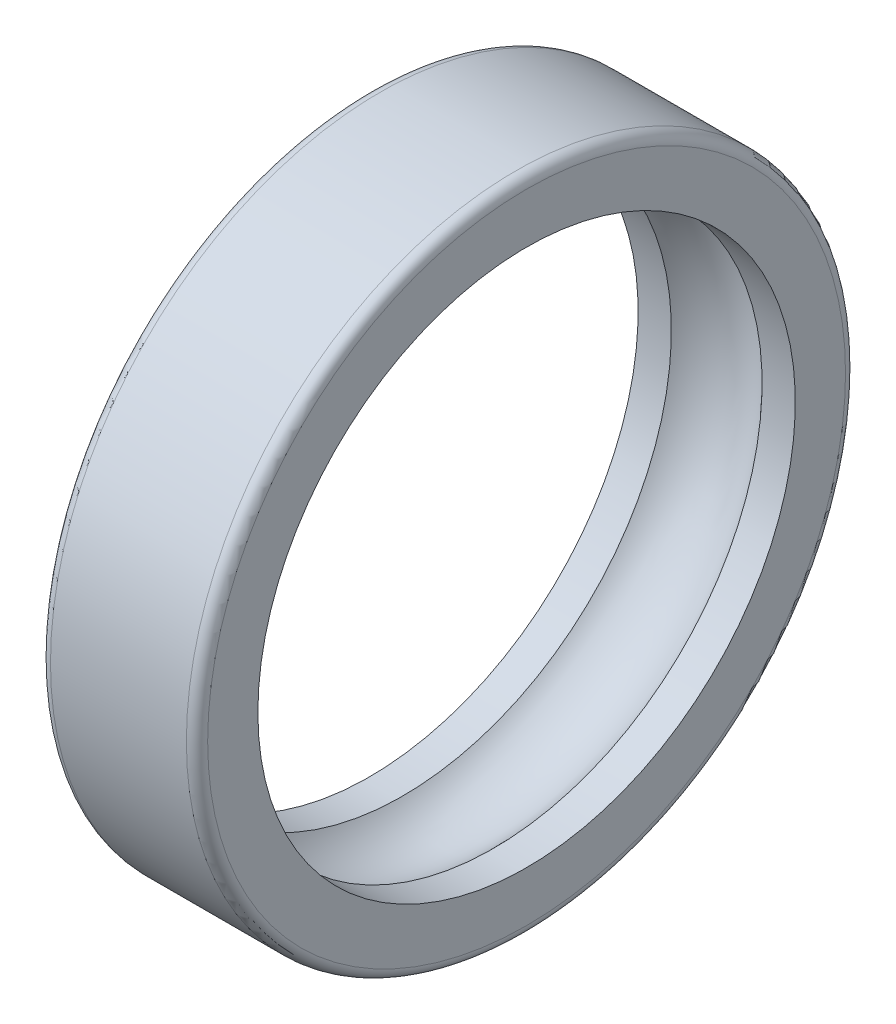
ISO-10303-21;
HEADER;
FILE_DESCRIPTION(('STEP AP214'),'2;1');
FILE_NAME('part.step','',(''),(''),'','','');
FILE_SCHEMA(('AUTOMOTIVE_DESIGN { 1 0 10303 214 1 1 1 1 }'));
ENDSEC;
DATA;
#1=APPLICATION_CONTEXT('core data for automotive mechanical design processes');
#2=APPLICATION_PROTOCOL_DEFINITION('international standard','automotive_design',2000,#1);
#3=PRODUCT_CONTEXT('',#1,'mechanical');
#4=PRODUCT('Part','Part','',(#3));
#5=PRODUCT_RELATED_PRODUCT_CATEGORY('part','',(#4));
#6=PRODUCT_DEFINITION_FORMATION('','',#4);
#7=PRODUCT_DEFINITION_CONTEXT('part definition',#1,'design');
#8=PRODUCT_DEFINITION('design','',#6,#7);
#9=PRODUCT_DEFINITION_SHAPE('','',#8);
#10=(LENGTH_UNIT() NAMED_UNIT(*) SI_UNIT(.MILLI.,.METRE.));
#11=(NAMED_UNIT(*) PLANE_ANGLE_UNIT() SI_UNIT($,.RADIAN.));
#12=(NAMED_UNIT(*) SI_UNIT($,.STERADIAN.) SOLID_ANGLE_UNIT());
#13=UNCERTAINTY_MEASURE_WITH_UNIT(LENGTH_MEASURE(1.E-05),#10,'distance_accuracy_value','');
#14=(GEOMETRIC_REPRESENTATION_CONTEXT(3) GLOBAL_UNCERTAINTY_ASSIGNED_CONTEXT((#13)) GLOBAL_UNIT_ASSIGNED_CONTEXT((#10,
#11,#12)) REPRESENTATION_CONTEXT('',''));
#15=CARTESIAN_POINT('',(0.,0.,0.));
#16=DIRECTION('',(0.,0.,1.));
#17=DIRECTION('',(1.,0.,0.));
#18=AXIS2_PLACEMENT_3D('',#15,#16,#17);
#19=CARTESIAN_POINT('',(-27.0862786606607,0.,0.));
#20=DIRECTION('',(-1.,0.,0.));
#21=DIRECTION('',(0.,0.,1.));
#22=AXIS2_PLACEMENT_3D('',#19,#20,#21);
#23=CYLINDRICAL_SURFACE('',#22,53.);
#24=CARTESIAN_POINT('',(15.5,0.,0.));
#25=DIRECTION('',(-1.,0.,0.));
#26=DIRECTION('',(0.,0.,1.));
#27=AXIS2_PLACEMENT_3D('',#24,#25,#26);
#28=CIRCLE('',#27,53.);
#29=CARTESIAN_POINT('',(15.5,0.,53.));
#30=VERTEX_POINT('',#29);
#31=EDGE_CURVE('E77',#30,#30,#28,.T.);
#32=ORIENTED_EDGE('',*,*,#31,.F.);
#33=EDGE_LOOP('',(#32));
#34=FACE_BOUND('',#33,.T.);
#35=CARTESIAN_POINT('',(8.94427190999916,0.,0.));
#36=DIRECTION('',(-1.,0.,0.));
#37=DIRECTION('',(0.,0.,1.));
#38=AXIS2_PLACEMENT_3D('',#35,#36,#37);
#39=CIRCLE('',#38,53.);
#40=CARTESIAN_POINT('',(8.94427190999916,0.,53.));
#41=VERTEX_POINT('',#40);
#42=EDGE_CURVE('E65',#41,#41,#39,.T.);
#43=ORIENTED_EDGE('',*,*,#42,.T.);
#44=EDGE_LOOP('',(#43));
#45=FACE_BOUND('',#44,.T.);
#46=ADVANCED_FACE('F41',(#34,#45),#23,.F.);
#47=CARTESIAN_POINT('',(0.,0.,0.));
#48=DIRECTION('',(-1.,0.,0.));
#49=DIRECTION('',(0.,0.,1.));
#50=AXIS2_PLACEMENT_3D('',#47,#48,#49);
#51=TOROIDAL_SURFACE('',#50,45.,12.);
#52=ORIENTED_EDGE('',*,*,#42,.F.);
#53=EDGE_LOOP('',(#52));
#54=FACE_BOUND('',#53,.T.);
#55=CARTESIAN_POINT('',(-8.94427190999916,0.,0.));
#56=DIRECTION('',(-1.,0.,0.));
#57=DIRECTION('',(0.,0.,1.));
#58=AXIS2_PLACEMENT_3D('',#55,#56,#57);
#59=CIRCLE('',#58,53.);
#60=CARTESIAN_POINT('',(-8.94427190999916,0.,53.));
#61=VERTEX_POINT('',#60);
#62=EDGE_CURVE('E69',#61,#61,#59,.T.);
#63=ORIENTED_EDGE('',*,*,#62,.T.);
#64=EDGE_LOOP('',(#63));
#65=FACE_BOUND('',#64,.T.);
#66=ADVANCED_FACE('F86',(#54,#65),#51,.F.);
#67=CARTESIAN_POINT('',(-27.0862786606607,0.,0.));
#68=DIRECTION('',(-1.,0.,0.));
#69=DIRECTION('',(0.,0.,1.));
#70=AXIS2_PLACEMENT_3D('',#67,#68,#69);
#71=CYLINDRICAL_SURFACE('',#70,53.);
#72=ORIENTED_EDGE('',*,*,#62,.F.);
#73=EDGE_LOOP('',(#72));
#74=FACE_BOUND('',#73,.T.);
#75=CARTESIAN_POINT('',(-15.5,0.,0.));
#76=DIRECTION('',(-1.,0.,0.));
#77=DIRECTION('',(0.,0.,1.));
#78=AXIS2_PLACEMENT_3D('',#75,#76,#77);
#79=CIRCLE('',#78,53.);
#80=CARTESIAN_POINT('',(-15.5,0.,53.));
#81=VERTEX_POINT('',#80);
#82=EDGE_CURVE('E73',#81,#81,#79,.T.);
#83=ORIENTED_EDGE('',*,*,#82,.T.);
#84=EDGE_LOOP('',(#83));
#85=FACE_BOUND('',#84,.T.);
#86=ADVANCED_FACE('F92',(#74,#85),#71,.F.);
#87=CARTESIAN_POINT('',(-15.5,65.,0.));
#88=DIRECTION('',(1.,0.,0.));
#89=DIRECTION('',(0.,0.,-1.));
#90=AXIS2_PLACEMENT_3D('',#87,#88,#89);
#91=PLANE('',#90);
#92=CARTESIAN_POINT('',(-15.5,0.,0.));
#93=DIRECTION('',(1.,0.,0.));
#94=DIRECTION('',(0.,0.,-1.));
#95=AXIS2_PLACEMENT_3D('',#92,#93,#94);
#96=CIRCLE('',#95,62.9);
#97=CARTESIAN_POINT('',(-15.5,0.,-62.9));
#98=VERTEX_POINT('',#97);
#99=EDGE_CURVE('E10',#98,#98,#96,.F.);
#100=ORIENTED_EDGE('',*,*,#99,.T.);
#101=EDGE_LOOP('',(#100));
#102=FACE_BOUND('',#101,.T.);
#103=ORIENTED_EDGE('',*,*,#82,.F.);
#104=EDGE_LOOP('',(#103));
#105=FACE_BOUND('',#104,.T.);
#106=ADVANCED_FACE('F98',(#102,#105),#91,.F.);
#107=CARTESIAN_POINT('',(-27.0862786606607,0.,0.));
#108=DIRECTION('',(-1.,0.,0.));
#109=DIRECTION('',(0.,0.,1.));
#110=AXIS2_PLACEMENT_3D('',#107,#108,#109);
#111=CYLINDRICAL_SURFACE('',#110,65.);
#112=CARTESIAN_POINT('',(13.4,0.,0.));
#113=DIRECTION('',(-1.,0.,0.));
#114=DIRECTION('',(0.,0.,1.));
#115=AXIS2_PLACEMENT_3D('',#112,#113,#114);
#116=CIRCLE('',#115,65.);
#117=CARTESIAN_POINT('',(13.4,0.,65.));
#118=VERTEX_POINT('',#117);
#119=EDGE_CURVE('E54',#118,#118,#116,.T.);
#120=ORIENTED_EDGE('',*,*,#119,.T.);
#121=EDGE_LOOP('',(#120));
#122=FACE_BOUND('',#121,.T.);
#123=CARTESIAN_POINT('',(-13.4,0.,0.));
#124=DIRECTION('',(1.,0.,0.));
#125=DIRECTION('',(0.,0.,-1.));
#126=AXIS2_PLACEMENT_3D('',#123,#124,#125);
#127=CIRCLE('',#126,65.);
#128=CARTESIAN_POINT('',(-13.4,0.,-65.));
#129=VERTEX_POINT('',#128);
#130=EDGE_CURVE('E59',#129,#129,#127,.T.);
#131=ORIENTED_EDGE('',*,*,#130,.T.);
#132=EDGE_LOOP('',(#131));
#133=FACE_BOUND('',#132,.T.);
#134=ADVANCED_FACE('F103',(#122,#133),#111,.T.);
#135=CARTESIAN_POINT('',(15.5,65.,0.));
#136=DIRECTION('',(-1.,0.,0.));
#137=DIRECTION('',(0.,0.,1.));
#138=AXIS2_PLACEMENT_3D('',#135,#136,#137);
#139=PLANE('',#138);
#140=CARTESIAN_POINT('',(15.5,0.,0.));
#141=DIRECTION('',(-1.,0.,0.));
#142=DIRECTION('',(0.,0.,1.));
#143=AXIS2_PLACEMENT_3D('',#140,#141,#142);
#144=CIRCLE('',#143,62.9);
#145=CARTESIAN_POINT('',(15.5,0.,62.9));
#146=VERTEX_POINT('',#145);
#147=EDGE_CURVE('E49',#146,#146,#144,.F.);
#148=ORIENTED_EDGE('',*,*,#147,.T.);
#149=EDGE_LOOP('',(#148));
#150=FACE_BOUND('',#149,.T.);
#151=ORIENTED_EDGE('',*,*,#31,.T.);
#152=EDGE_LOOP('',(#151));
#153=FACE_BOUND('',#152,.T.);
#154=ADVANCED_FACE('F82',(#150,#153),#139,.F.);
#155=CARTESIAN_POINT('',(13.4,0.,0.));
#156=DIRECTION('',(-1.,0.,0.));
#157=DIRECTION('',(0.,0.,1.));
#158=AXIS2_PLACEMENT_3D('',#155,#156,#157);
#159=TOROIDAL_SURFACE('',#158,62.9,2.1);
#160=ORIENTED_EDGE('',*,*,#147,.F.);
#161=EDGE_LOOP('',(#160));
#162=FACE_BOUND('',#161,.T.);
#163=ORIENTED_EDGE('',*,*,#119,.F.);
#164=EDGE_LOOP('',(#163));
#165=FACE_BOUND('',#164,.T.);
#166=ADVANCED_FACE('F111',(#162,#165),#159,.T.);
#167=CARTESIAN_POINT('',(-13.4,0.,0.));
#168=DIRECTION('',(1.,0.,0.));
#169=DIRECTION('',(0.,0.,-1.));
#170=AXIS2_PLACEMENT_3D('',#167,#168,#169);
#171=TOROIDAL_SURFACE('',#170,62.9,2.1);
#172=ORIENTED_EDGE('',*,*,#130,.F.);
#173=EDGE_LOOP('',(#172));
#174=FACE_BOUND('',#173,.T.);
#175=ORIENTED_EDGE('',*,*,#99,.F.);
#176=EDGE_LOOP('',(#175));
#177=FACE_BOUND('',#176,.T.);
#178=ADVANCED_FACE('F43',(#174,#177),#171,.T.);
#179=CLOSED_SHELL('',(#46,#66,#86,#106,#134,#154,#166,#178));
#180=MANIFOLD_SOLID_BREP('B2',#179);
#181=ADVANCED_BREP_SHAPE_REPRESENTATION('',(#18,#180),#14);
#182=SHAPE_DEFINITION_REPRESENTATION(#9,#181);
ENDSEC;
END-ISO-10303-21;
